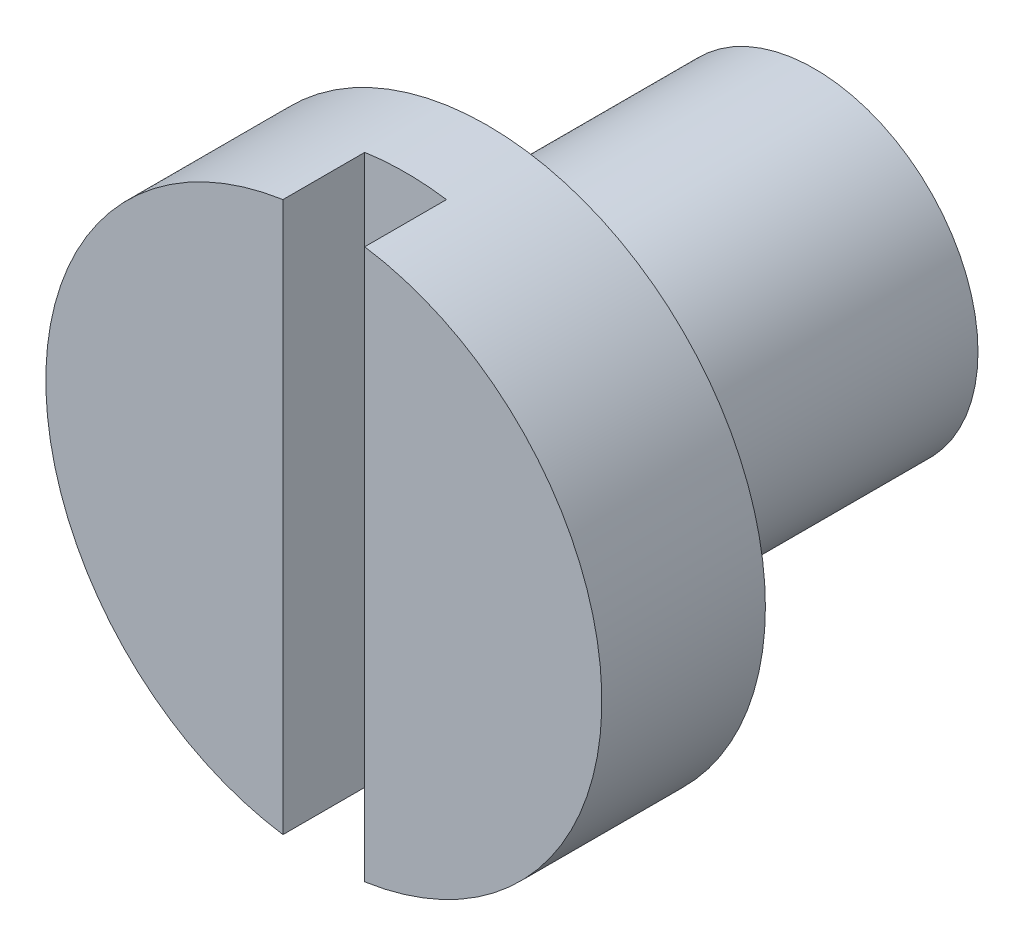
ISO-10303-21;
HEADER;
FILE_DESCRIPTION(('STEP AP214'),'2;1');
FILE_NAME('part.step','',(''),(''),'','','');
FILE_SCHEMA(('AUTOMOTIVE_DESIGN { 1 0 10303 214 1 1 1 1 }'));
ENDSEC;
DATA;
#1=APPLICATION_CONTEXT('core data for automotive mechanical design processes');
#2=APPLICATION_PROTOCOL_DEFINITION('international standard','automotive_design',2000,#1);
#3=PRODUCT_CONTEXT('',#1,'mechanical');
#4=PRODUCT('Part','Part','',(#3));
#5=PRODUCT_RELATED_PRODUCT_CATEGORY('part','',(#4));
#6=PRODUCT_DEFINITION_FORMATION('','',#4);
#7=PRODUCT_DEFINITION_CONTEXT('part definition',#1,'design');
#8=PRODUCT_DEFINITION('design','',#6,#7);
#9=PRODUCT_DEFINITION_SHAPE('','',#8);
#10=(LENGTH_UNIT() NAMED_UNIT(*) SI_UNIT(.MILLI.,.METRE.));
#11=(NAMED_UNIT(*) PLANE_ANGLE_UNIT() SI_UNIT($,.RADIAN.));
#12=(NAMED_UNIT(*) SI_UNIT($,.STERADIAN.) SOLID_ANGLE_UNIT());
#13=UNCERTAINTY_MEASURE_WITH_UNIT(LENGTH_MEASURE(1.E-05),#10,'distance_accuracy_value','');
#14=(GEOMETRIC_REPRESENTATION_CONTEXT(3) GLOBAL_UNCERTAINTY_ASSIGNED_CONTEXT((#13)) GLOBAL_UNIT_ASSIGNED_CONTEXT((#10,
#11,#12)) REPRESENTATION_CONTEXT('',''));
#15=CARTESIAN_POINT('',(0.,0.,0.));
#16=DIRECTION('',(0.,0.,1.));
#17=DIRECTION('',(1.,0.,0.));
#18=AXIS2_PLACEMENT_3D('',#15,#16,#17);
#19=CARTESIAN_POINT('',(0.,0.,3.175));
#20=DIRECTION('',(0.,0.,1.));
#21=DIRECTION('',(1.,0.,0.));
#22=AXIS2_PLACEMENT_3D('',#19,#20,#21);
#23=PLANE('',#22);
#24=DIRECTION('',(0.,-1.,0.));
#25=VECTOR('',#24,1.);
#26=CARTESIAN_POINT('',(-1.5875,0.,3.175));
#27=LINE('',#26,#25);
#28=CARTESIAN_POINT('',(-1.5875,10.6776340427081,3.175));
#29=VERTEX_POINT('',#28);
#30=CARTESIAN_POINT('',(-1.5875,-10.6776340427081,3.175));
#31=VERTEX_POINT('',#30);
#32=EDGE_CURVE('E92',#29,#31,#27,.T.);
#33=ORIENTED_EDGE('',*,*,#32,.F.);
#34=CARTESIAN_POINT('',(0.,0.,3.175));
#35=DIRECTION('',(0.,0.,1.));
#36=DIRECTION('',(1.,0.,0.));
#37=AXIS2_PLACEMENT_3D('',#34,#35,#36);
#38=CIRCLE('',#37,10.795);
#39=EDGE_CURVE('E106',#29,#31,#38,.T.);
#40=ORIENTED_EDGE('',*,*,#39,.T.);
#41=EDGE_LOOP('',(#33,#40));
#42=FACE_BOUND('',#41,.T.);
#43=ADVANCED_FACE('F43',(#42),#23,.T.);
#44=CARTESIAN_POINT('',(0.,0.,3.175));
#45=DIRECTION('',(0.,0.,-1.));
#46=DIRECTION('',(-1.,0.,0.));
#47=AXIS2_PLACEMENT_3D('',#44,#45,#46);
#48=CYLINDRICAL_SURFACE('',#47,10.795);
#49=ORIENTED_EDGE('',*,*,#39,.F.);
#50=DIRECTION('',(0.,0.,-1.));
#51=VECTOR('',#50,1.);
#52=CARTESIAN_POINT('',(-1.5875,10.6776340427081,3.175));
#53=LINE('',#52,#51);
#54=CARTESIAN_POINT('',(-1.5875,10.6776340427081,0.));
#55=VERTEX_POINT('',#54);
#56=EDGE_CURVE('E129',#29,#55,#53,.T.);
#57=ORIENTED_EDGE('',*,*,#56,.T.);
#58=CARTESIAN_POINT('',(0.,0.,0.));
#59=DIRECTION('',(0.,0.,1.));
#60=DIRECTION('',(1.,0.,0.));
#61=AXIS2_PLACEMENT_3D('',#58,#59,#60);
#62=CIRCLE('',#61,10.795);
#63=CARTESIAN_POINT('',(1.5875,10.6776340427081,0.));
#64=VERTEX_POINT('',#63);
#65=EDGE_CURVE('E11',#64,#55,#62,.T.);
#66=ORIENTED_EDGE('',*,*,#65,.F.);
#67=DIRECTION('',(0.,0.,-1.));
#68=VECTOR('',#67,1.);
#69=CARTESIAN_POINT('',(1.5875,10.6776340427081,3.175));
#70=LINE('',#69,#68);
#71=CARTESIAN_POINT('',(1.5875,10.6776340427081,3.175));
#72=VERTEX_POINT('',#71);
#73=EDGE_CURVE('E86',#64,#72,#70,.F.);
#74=ORIENTED_EDGE('',*,*,#73,.T.);
#75=CARTESIAN_POINT('',(1.5875,-10.6776340427081,3.175));
#76=VERTEX_POINT('',#75);
#77=EDGE_CURVE('E99',#76,#72,#38,.T.);
#78=ORIENTED_EDGE('',*,*,#77,.F.);
#79=DIRECTION('',(0.,0.,-1.));
#80=VECTOR('',#79,1.);
#81=CARTESIAN_POINT('',(1.5875,-10.6776340427081,3.175));
#82=LINE('',#81,#80);
#83=CARTESIAN_POINT('',(1.5875,-10.6776340427081,0.));
#84=VERTEX_POINT('',#83);
#85=EDGE_CURVE('E59',#76,#84,#82,.T.);
#86=ORIENTED_EDGE('',*,*,#85,.T.);
#87=CARTESIAN_POINT('',(-1.5875,-10.6776340427081,0.));
#88=VERTEX_POINT('',#87);
#89=EDGE_CURVE('E47',#88,#84,#62,.T.);
#90=ORIENTED_EDGE('',*,*,#89,.F.);
#91=DIRECTION('',(0.,0.,-1.));
#92=VECTOR('',#91,1.);
#93=CARTESIAN_POINT('',(-1.5875,-10.6776340427081,3.175));
#94=LINE('',#93,#92);
#95=EDGE_CURVE('E67',#88,#31,#94,.F.);
#96=ORIENTED_EDGE('',*,*,#95,.T.);
#97=EDGE_LOOP('',(#49,#57,#66,#74,#78,#86,#90,#96));
#98=FACE_BOUND('',#97,.T.);
#99=CARTESIAN_POINT('',(0.,0.,-3.175));
#100=DIRECTION('',(0.,0.,1.));
#101=DIRECTION('',(1.,0.,0.));
#102=AXIS2_PLACEMENT_3D('',#99,#100,#101);
#103=CIRCLE('',#102,10.795);
#104=CARTESIAN_POINT('',(10.795,0.,-3.175));
#105=VERTEX_POINT('',#104);
#106=EDGE_CURVE('E107',#105,#105,#103,.T.);
#107=ORIENTED_EDGE('',*,*,#106,.T.);
#108=EDGE_LOOP('',(#107));
#109=FACE_BOUND('',#108,.T.);
#110=ADVANCED_FACE('F45',(#98,#109),#48,.T.);
#111=DIRECTION('',(0.,1.,0.));
#112=VECTOR('',#111,1.);
#113=CARTESIAN_POINT('',(1.5875,0.,3.175));
#114=LINE('',#113,#112);
#115=EDGE_CURVE('E83',#76,#72,#114,.T.);
#116=ORIENTED_EDGE('',*,*,#115,.F.);
#117=ORIENTED_EDGE('',*,*,#77,.T.);
#118=EDGE_LOOP('',(#116,#117));
#119=FACE_BOUND('',#118,.T.);
#120=ADVANCED_FACE('F104',(#119),#23,.T.);
#121=CARTESIAN_POINT('',(0.,0.,-3.175));
#122=DIRECTION('',(0.,0.,1.));
#123=DIRECTION('',(1.,0.,0.));
#124=AXIS2_PLACEMENT_3D('',#121,#122,#123);
#125=PLANE('',#124);
#126=CARTESIAN_POINT('',(0.,0.,-3.175));
#127=DIRECTION('',(0.,0.,-1.));
#128=DIRECTION('',(-1.,0.,0.));
#129=AXIS2_PLACEMENT_3D('',#126,#127,#128);
#130=CIRCLE('',#129,6.35);
#131=CARTESIAN_POINT('',(-6.35,0.,-3.175));
#132=VERTEX_POINT('',#131);
#133=EDGE_CURVE('E93',#132,#132,#130,.T.);
#134=ORIENTED_EDGE('',*,*,#133,.F.);
#135=EDGE_LOOP('',(#134));
#136=FACE_BOUND('',#135,.T.);
#137=ORIENTED_EDGE('',*,*,#106,.F.);
#138=EDGE_LOOP('',(#137));
#139=FACE_BOUND('',#138,.T.);
#140=ADVANCED_FACE('F142',(#136,#139),#125,.F.);
#141=CARTESIAN_POINT('',(0.,0.,-15.875));
#142=DIRECTION('',(0.,0.,1.));
#143=DIRECTION('',(1.,0.,0.));
#144=AXIS2_PLACEMENT_3D('',#141,#142,#143);
#145=CYLINDRICAL_SURFACE('',#144,6.35);
#146=CARTESIAN_POINT('',(0.,0.,-15.875));
#147=DIRECTION('',(0.,0.,-1.));
#148=DIRECTION('',(-1.,0.,0.));
#149=AXIS2_PLACEMENT_3D('',#146,#147,#148);
#150=CIRCLE('',#149,6.35);
#151=CARTESIAN_POINT('',(-6.35,0.,-15.875));
#152=VERTEX_POINT('',#151);
#153=EDGE_CURVE('E113',#152,#152,#150,.T.);
#154=ORIENTED_EDGE('',*,*,#153,.F.);
#155=EDGE_LOOP('',(#154));
#156=FACE_BOUND('',#155,.T.);
#157=ORIENTED_EDGE('',*,*,#133,.T.);
#158=EDGE_LOOP('',(#157));
#159=FACE_BOUND('',#158,.T.);
#160=ADVANCED_FACE('F139',(#156,#159),#145,.T.);
#161=CARTESIAN_POINT('',(0.,0.,-15.875));
#162=DIRECTION('',(0.,0.,-1.));
#163=DIRECTION('',(-1.,0.,0.));
#164=AXIS2_PLACEMENT_3D('',#161,#162,#163);
#165=PLANE('',#164);
#166=ORIENTED_EDGE('',*,*,#153,.T.);
#167=EDGE_LOOP('',(#166));
#168=FACE_BOUND('',#167,.T.);
#169=ADVANCED_FACE('F137',(#168),#165,.T.);
#170=CARTESIAN_POINT('',(0.,0.,0.));
#171=DIRECTION('',(0.,0.,1.));
#172=DIRECTION('',(1.,0.,0.));
#173=AXIS2_PLACEMENT_3D('',#170,#171,#172);
#174=PLANE('',#173);
#175=ORIENTED_EDGE('',*,*,#65,.T.);
#176=DIRECTION('',(0.,-1.,0.));
#177=VECTOR('',#176,1.);
#178=CARTESIAN_POINT('',(-1.5875,-12.7,0.));
#179=LINE('',#178,#177);
#180=EDGE_CURVE('E123',#55,#88,#179,.T.);
#181=ORIENTED_EDGE('',*,*,#180,.T.);
#182=ORIENTED_EDGE('',*,*,#89,.T.);
#183=DIRECTION('',(0.,1.,0.));
#184=VECTOR('',#183,1.);
#185=CARTESIAN_POINT('',(1.5875,-12.7,0.));
#186=LINE('',#185,#184);
#187=EDGE_CURVE('E102',#84,#64,#186,.T.);
#188=ORIENTED_EDGE('',*,*,#187,.T.);
#189=EDGE_LOOP('',(#175,#181,#182,#188));
#190=FACE_BOUND('',#189,.T.);
#191=ADVANCED_FACE('F122',(#190),#174,.T.);
#192=CARTESIAN_POINT('',(-1.5875,-12.7,0.));
#193=DIRECTION('',(-1.,0.,0.));
#194=DIRECTION('',(0.,0.,1.));
#195=AXIS2_PLACEMENT_3D('',#192,#193,#194);
#196=PLANE('',#195);
#197=ORIENTED_EDGE('',*,*,#32,.T.);
#198=ORIENTED_EDGE('',*,*,#95,.F.);
#199=ORIENTED_EDGE('',*,*,#180,.F.);
#200=ORIENTED_EDGE('',*,*,#56,.F.);
#201=EDGE_LOOP('',(#197,#198,#199,#200));
#202=FACE_BOUND('',#201,.T.);
#203=ADVANCED_FACE('F163',(#202),#196,.F.);
#204=CARTESIAN_POINT('',(1.5875,-12.7,0.));
#205=DIRECTION('',(1.,0.,0.));
#206=DIRECTION('',(0.,0.,-1.));
#207=AXIS2_PLACEMENT_3D('',#204,#205,#206);
#208=PLANE('',#207);
#209=ORIENTED_EDGE('',*,*,#115,.T.);
#210=ORIENTED_EDGE('',*,*,#73,.F.);
#211=ORIENTED_EDGE('',*,*,#187,.F.);
#212=ORIENTED_EDGE('',*,*,#85,.F.);
#213=EDGE_LOOP('',(#209,#210,#211,#212));
#214=FACE_BOUND('',#213,.T.);
#215=ADVANCED_FACE('F85',(#214),#208,.F.);
#216=CLOSED_SHELL('',(#43,#110,#120,#140,#160,#169,#191,#203,#215));
#217=MANIFOLD_SOLID_BREP('B2',#216);
#218=ADVANCED_BREP_SHAPE_REPRESENTATION('',(#18,#217),#14);
#219=SHAPE_DEFINITION_REPRESENTATION(#9,#218);
ENDSEC;
END-ISO-10303-21;
